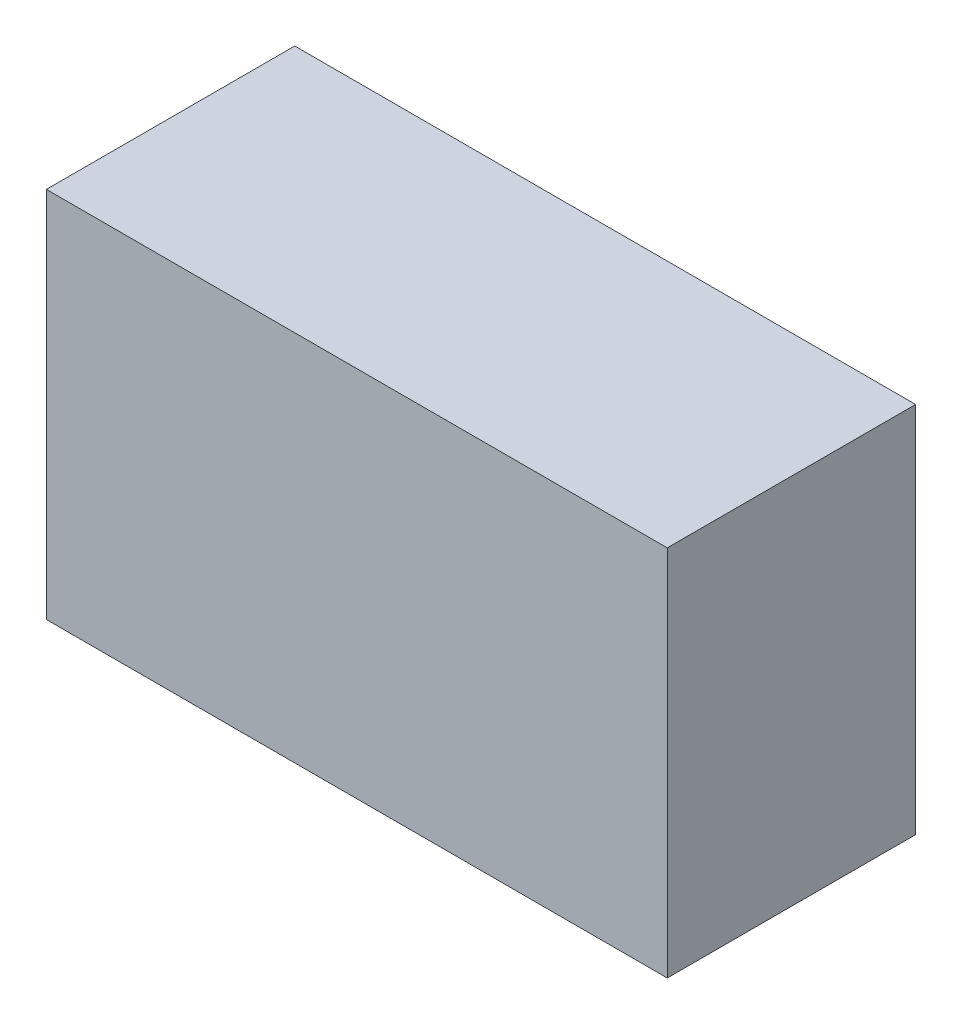
ISO-10303-21;
HEADER;
FILE_DESCRIPTION(('STEP AP214'),'2;1');
FILE_NAME('part.step','',(''),(''),'','','');
FILE_SCHEMA(('AUTOMOTIVE_DESIGN { 1 0 10303 214 1 1 1 1 }'));
ENDSEC;
DATA;
#1=APPLICATION_CONTEXT('core data for automotive mechanical design processes');
#2=APPLICATION_PROTOCOL_DEFINITION('international standard','automotive_design',2000,#1);
#3=PRODUCT_CONTEXT('',#1,'mechanical');
#4=PRODUCT('Part','Part','',(#3));
#5=PRODUCT_RELATED_PRODUCT_CATEGORY('part','',(#4));
#6=PRODUCT_DEFINITION_FORMATION('','',#4);
#7=PRODUCT_DEFINITION_CONTEXT('part definition',#1,'design');
#8=PRODUCT_DEFINITION('design','',#6,#7);
#9=PRODUCT_DEFINITION_SHAPE('','',#8);
#10=(LENGTH_UNIT() NAMED_UNIT(*) SI_UNIT(.MILLI.,.METRE.));
#11=(NAMED_UNIT(*) PLANE_ANGLE_UNIT() SI_UNIT($,.RADIAN.));
#12=(NAMED_UNIT(*) SI_UNIT($,.STERADIAN.) SOLID_ANGLE_UNIT());
#13=UNCERTAINTY_MEASURE_WITH_UNIT(LENGTH_MEASURE(1.E-05),#10,'distance_accuracy_value','');
#14=(GEOMETRIC_REPRESENTATION_CONTEXT(3) GLOBAL_UNCERTAINTY_ASSIGNED_CONTEXT((#13)) GLOBAL_UNIT_ASSIGNED_CONTEXT((#10,
#11,#12)) REPRESENTATION_CONTEXT('',''));
#15=CARTESIAN_POINT('',(0.,0.,0.));
#16=DIRECTION('',(0.,0.,1.));
#17=DIRECTION('',(1.,0.,0.));
#18=AXIS2_PLACEMENT_3D('',#15,#16,#17);
#19=CARTESIAN_POINT('',(-15.7382437908213,-2.02294477258915,-1.));
#20=DIRECTION('',(0.,1.,0.));
#21=DIRECTION('',(0.,0.,1.));
#22=AXIS2_PLACEMENT_3D('',#19,#20,#21);
#23=PLANE('',#22);
#24=DIRECTION('',(-1.,0.,0.));
#25=VECTOR('',#24,1.);
#26=CARTESIAN_POINT('',(-15.4882437908213,-2.02294477258915,-1.));
#27=LINE('',#26,#25);
#28=CARTESIAN_POINT('',(-14.4882437908213,-2.02294477258915,-1.));
#29=VERTEX_POINT('',#28);
#30=CARTESIAN_POINT('',(-16.9882437908213,-2.02294477258915,-1.));
#31=VERTEX_POINT('',#30);
#32=EDGE_CURVE('E68',#29,#31,#27,.T.);
#33=ORIENTED_EDGE('',*,*,#32,.F.);
#34=DIRECTION('',(0.,0.,-1.));
#35=VECTOR('',#34,1.);
#36=CARTESIAN_POINT('',(-14.4882437908213,-2.02294477258915,-1.));
#37=LINE('',#36,#35);
#38=CARTESIAN_POINT('',(-14.4882437908213,-2.02294477258915,-2.));
#39=VERTEX_POINT('',#38);
#40=EDGE_CURVE('E55',#39,#29,#37,.F.);
#41=ORIENTED_EDGE('',*,*,#40,.F.);
#42=DIRECTION('',(-1.,0.,0.));
#43=VECTOR('',#42,1.);
#44=CARTESIAN_POINT('',(-15.4882437908213,-2.02294477258915,-2.));
#45=LINE('',#44,#43);
#46=CARTESIAN_POINT('',(-16.9882437908213,-2.02294477258915,-2.));
#47=VERTEX_POINT('',#46);
#48=EDGE_CURVE('E61',#47,#39,#45,.F.);
#49=ORIENTED_EDGE('',*,*,#48,.F.);
#50=DIRECTION('',(0.,0.,1.));
#51=VECTOR('',#50,1.);
#52=CARTESIAN_POINT('',(-16.9882437908213,-2.02294477258915,-1.));
#53=LINE('',#52,#51);
#54=EDGE_CURVE('E19',#47,#31,#53,.T.);
#55=ORIENTED_EDGE('',*,*,#54,.T.);
#56=EDGE_LOOP('',(#33,#41,#49,#55));
#57=FACE_BOUND('',#56,.T.);
#58=ADVANCED_FACE('F16',(#57),#23,.T.);
#59=CARTESIAN_POINT('',(-15.4882437908213,-5.54294477258915,-2.));
#60=DIRECTION('',(0.,0.,-1.));
#61=DIRECTION('',(-1.,0.,0.));
#62=AXIS2_PLACEMENT_3D('',#59,#60,#61);
#63=PLANE('',#62);
#64=ORIENTED_EDGE('',*,*,#48,.T.);
#65=DIRECTION('',(0.,1.,0.));
#66=VECTOR('',#65,1.);
#67=CARTESIAN_POINT('',(-14.4882437908213,-2.77294477258915,-2.));
#68=LINE('',#67,#66);
#69=CARTESIAN_POINT('',(-14.4882437908213,-3.52294477258915,-2.));
#70=VERTEX_POINT('',#69);
#71=EDGE_CURVE('E63',#70,#39,#68,.T.);
#72=ORIENTED_EDGE('',*,*,#71,.F.);
#73=DIRECTION('',(1.,0.,0.));
#74=VECTOR('',#73,1.);
#75=CARTESIAN_POINT('',(-15.7382437908213,-3.52294477258915,-2.));
#76=LINE('',#75,#74);
#77=CARTESIAN_POINT('',(-16.9882437908213,-3.52294477258915,-2.));
#78=VERTEX_POINT('',#77);
#79=EDGE_CURVE('E82',#78,#70,#76,.T.);
#80=ORIENTED_EDGE('',*,*,#79,.F.);
#81=DIRECTION('',(0.,1.,0.));
#82=VECTOR('',#81,1.);
#83=CARTESIAN_POINT('',(-16.9882437908213,-2.77294477258915,-2.));
#84=LINE('',#83,#82);
#85=EDGE_CURVE('E66',#47,#78,#84,.F.);
#86=ORIENTED_EDGE('',*,*,#85,.F.);
#87=EDGE_LOOP('',(#64,#72,#80,#86));
#88=FACE_BOUND('',#87,.T.);
#89=ADVANCED_FACE('F62',(#88),#63,.T.);
#90=CARTESIAN_POINT('',(-14.4882437908213,-2.77294477258915,-1.));
#91=DIRECTION('',(1.,0.,0.));
#92=DIRECTION('',(0.,0.,-1.));
#93=AXIS2_PLACEMENT_3D('',#90,#91,#92);
#94=PLANE('',#93);
#95=DIRECTION('',(0.,1.,0.));
#96=VECTOR('',#95,1.);
#97=CARTESIAN_POINT('',(-14.4882437908213,-5.54294477258915,-1.));
#98=LINE('',#97,#96);
#99=CARTESIAN_POINT('',(-14.4882437908213,-3.52294477258915,-1.));
#100=VERTEX_POINT('',#99);
#101=EDGE_CURVE('E70',#100,#29,#98,.T.);
#102=ORIENTED_EDGE('',*,*,#101,.F.);
#103=DIRECTION('',(0.,0.,-1.));
#104=VECTOR('',#103,1.);
#105=CARTESIAN_POINT('',(-14.4882437908213,-3.52294477258915,-1.));
#106=LINE('',#105,#104);
#107=EDGE_CURVE('E74',#70,#100,#106,.F.);
#108=ORIENTED_EDGE('',*,*,#107,.F.);
#109=ORIENTED_EDGE('',*,*,#71,.T.);
#110=ORIENTED_EDGE('',*,*,#40,.T.);
#111=EDGE_LOOP('',(#102,#108,#109,#110));
#112=FACE_BOUND('',#111,.T.);
#113=ADVANCED_FACE('F72',(#112),#94,.T.);
#114=CARTESIAN_POINT('',(-15.4882437908213,-5.54294477258915,-1.));
#115=DIRECTION('',(0.,0.,-1.));
#116=DIRECTION('',(-1.,0.,0.));
#117=AXIS2_PLACEMENT_3D('',#114,#115,#116);
#118=PLANE('',#117);
#119=ORIENTED_EDGE('',*,*,#101,.T.);
#120=ORIENTED_EDGE('',*,*,#32,.T.);
#121=DIRECTION('',(0.,1.,0.));
#122=VECTOR('',#121,1.);
#123=CARTESIAN_POINT('',(-16.9882437908213,-2.77294477258915,-1.));
#124=LINE('',#123,#122);
#125=CARTESIAN_POINT('',(-16.9882437908213,-3.52294477258915,-1.));
#126=VERTEX_POINT('',#125);
#127=EDGE_CURVE('E34',#126,#31,#124,.T.);
#128=ORIENTED_EDGE('',*,*,#127,.F.);
#129=DIRECTION('',(1.,0.,0.));
#130=VECTOR('',#129,1.);
#131=CARTESIAN_POINT('',(-15.7382437908213,-3.52294477258915,-1.));
#132=LINE('',#131,#130);
#133=EDGE_CURVE('E25',#100,#126,#132,.F.);
#134=ORIENTED_EDGE('',*,*,#133,.F.);
#135=EDGE_LOOP('',(#119,#120,#128,#134));
#136=FACE_BOUND('',#135,.T.);
#137=ADVANCED_FACE('F88',(#136),#118,.F.);
#138=CARTESIAN_POINT('',(-16.9882437908213,-2.77294477258915,-1.));
#139=DIRECTION('',(-1.,0.,0.));
#140=DIRECTION('',(0.,0.,1.));
#141=AXIS2_PLACEMENT_3D('',#138,#139,#140);
#142=PLANE('',#141);
#143=ORIENTED_EDGE('',*,*,#127,.T.);
#144=ORIENTED_EDGE('',*,*,#54,.F.);
#145=ORIENTED_EDGE('',*,*,#85,.T.);
#146=DIRECTION('',(0.,0.,-1.));
#147=VECTOR('',#146,1.);
#148=CARTESIAN_POINT('',(-16.9882437908213,-3.52294477258915,-1.));
#149=LINE('',#148,#147);
#150=EDGE_CURVE('E11',#126,#78,#149,.T.);
#151=ORIENTED_EDGE('',*,*,#150,.F.);
#152=EDGE_LOOP('',(#143,#144,#145,#151));
#153=FACE_BOUND('',#152,.T.);
#154=ADVANCED_FACE('F90',(#153),#142,.T.);
#155=CARTESIAN_POINT('',(-15.7382437908213,-3.52294477258915,-1.));
#156=DIRECTION('',(0.,-1.,0.));
#157=DIRECTION('',(0.,0.,-1.));
#158=AXIS2_PLACEMENT_3D('',#155,#156,#157);
#159=PLANE('',#158);
#160=ORIENTED_EDGE('',*,*,#133,.T.);
#161=ORIENTED_EDGE('',*,*,#150,.T.);
#162=ORIENTED_EDGE('',*,*,#79,.T.);
#163=ORIENTED_EDGE('',*,*,#107,.T.);
#164=EDGE_LOOP('',(#160,#161,#162,#163));
#165=FACE_BOUND('',#164,.T.);
#166=ADVANCED_FACE('F87',(#165),#159,.T.);
#167=CLOSED_SHELL('',(#58,#89,#113,#137,#154,#166));
#168=MANIFOLD_SOLID_BREP('B1',#167);
#169=ADVANCED_BREP_SHAPE_REPRESENTATION('',(#18,#168),#14);
#170=SHAPE_DEFINITION_REPRESENTATION(#9,#169);
ENDSEC;
END-ISO-10303-21;
